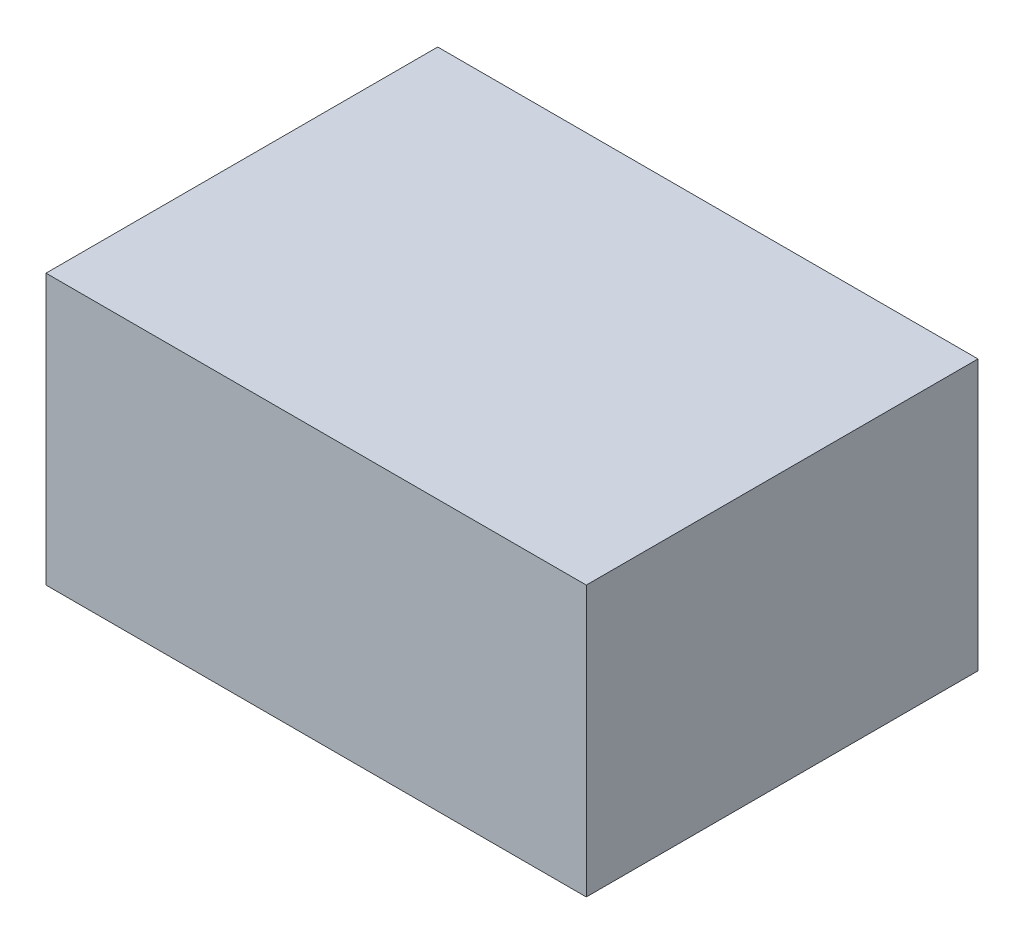
ISO-10303-21;
HEADER;
FILE_DESCRIPTION(('STEP AP214'),'2;1');
FILE_NAME('part.step','',(''),(''),'','','');
FILE_SCHEMA(('AUTOMOTIVE_DESIGN { 1 0 10303 214 1 1 1 1 }'));
ENDSEC;
DATA;
#1=APPLICATION_CONTEXT('core data for automotive mechanical design processes');
#2=APPLICATION_PROTOCOL_DEFINITION('international standard','automotive_design',2000,#1);
#3=PRODUCT_CONTEXT('',#1,'mechanical');
#4=PRODUCT('Part','Part','',(#3));
#5=PRODUCT_RELATED_PRODUCT_CATEGORY('part','',(#4));
#6=PRODUCT_DEFINITION_FORMATION('','',#4);
#7=PRODUCT_DEFINITION_CONTEXT('part definition',#1,'design');
#8=PRODUCT_DEFINITION('design','',#6,#7);
#9=PRODUCT_DEFINITION_SHAPE('','',#8);
#10=(LENGTH_UNIT() NAMED_UNIT(*) SI_UNIT(.MILLI.,.METRE.));
#11=(NAMED_UNIT(*) PLANE_ANGLE_UNIT() SI_UNIT($,.RADIAN.));
#12=(NAMED_UNIT(*) SI_UNIT($,.STERADIAN.) SOLID_ANGLE_UNIT());
#13=UNCERTAINTY_MEASURE_WITH_UNIT(LENGTH_MEASURE(1.E-05),#10,'distance_accuracy_value','');
#14=(GEOMETRIC_REPRESENTATION_CONTEXT(3) GLOBAL_UNCERTAINTY_ASSIGNED_CONTEXT((#13)) GLOBAL_UNIT_ASSIGNED_CONTEXT((#10,
#11,#12)) REPRESENTATION_CONTEXT('',''));
#15=CARTESIAN_POINT('',(0.,0.,0.));
#16=DIRECTION('',(0.,0.,1.));
#17=DIRECTION('',(1.,0.,0.));
#18=AXIS2_PLACEMENT_3D('',#15,#16,#17);
#19=CARTESIAN_POINT('',(-40.,40.,-29.));
#20=DIRECTION('',(1.,0.,0.));
#21=DIRECTION('',(0.,0.,-1.));
#22=AXIS2_PLACEMENT_3D('',#19,#20,#21);
#23=PLANE('',#22);
#24=DIRECTION('',(0.,0.,1.));
#25=VECTOR('',#24,1.);
#26=CARTESIAN_POINT('',(-40.,0.,-29.));
#27=LINE('',#26,#25);
#28=CARTESIAN_POINT('',(-40.,0.,-29.));
#29=VERTEX_POINT('',#28);
#30=CARTESIAN_POINT('',(-40.,0.,29.));
#31=VERTEX_POINT('',#30);
#32=EDGE_CURVE('E104',#29,#31,#27,.T.);
#33=ORIENTED_EDGE('',*,*,#32,.T.);
#34=DIRECTION('',(0.,-1.,0.));
#35=VECTOR('',#34,1.);
#36=CARTESIAN_POINT('',(-40.,40.,29.));
#37=LINE('',#36,#35);
#38=CARTESIAN_POINT('',(-40.,40.,29.));
#39=VERTEX_POINT('',#38);
#40=EDGE_CURVE('E11',#39,#31,#37,.T.);
#41=ORIENTED_EDGE('',*,*,#40,.F.);
#42=DIRECTION('',(0.,0.,1.));
#43=VECTOR('',#42,1.);
#44=CARTESIAN_POINT('',(-40.,40.,-29.));
#45=LINE('',#44,#43);
#46=CARTESIAN_POINT('',(-40.,40.,-29.));
#47=VERTEX_POINT('',#46);
#48=EDGE_CURVE('E92',#47,#39,#45,.T.);
#49=ORIENTED_EDGE('',*,*,#48,.F.);
#50=DIRECTION('',(0.,-1.,0.));
#51=VECTOR('',#50,1.);
#52=CARTESIAN_POINT('',(-40.,40.,-29.));
#53=LINE('',#52,#51);
#54=EDGE_CURVE('E100',#47,#29,#53,.T.);
#55=ORIENTED_EDGE('',*,*,#54,.T.);
#56=EDGE_LOOP('',(#33,#41,#49,#55));
#57=FACE_BOUND('',#56,.T.);
#58=ADVANCED_FACE('F41',(#57),#23,.F.);
#59=CARTESIAN_POINT('',(40.,40.,29.));
#60=DIRECTION('',(0.,0.,-1.));
#61=DIRECTION('',(-1.,0.,0.));
#62=AXIS2_PLACEMENT_3D('',#59,#60,#61);
#63=PLANE('',#62);
#64=DIRECTION('',(1.,0.,0.));
#65=VECTOR('',#64,1.);
#66=CARTESIAN_POINT('',(40.,0.,29.));
#67=LINE('',#66,#65);
#68=CARTESIAN_POINT('',(40.,0.,29.));
#69=VERTEX_POINT('',#68);
#70=EDGE_CURVE('E96',#31,#69,#67,.T.);
#71=ORIENTED_EDGE('',*,*,#70,.T.);
#72=DIRECTION('',(0.,-1.,0.));
#73=VECTOR('',#72,1.);
#74=CARTESIAN_POINT('',(40.,40.,29.));
#75=LINE('',#74,#73);
#76=CARTESIAN_POINT('',(40.,40.,29.));
#77=VERTEX_POINT('',#76);
#78=EDGE_CURVE('E49',#77,#69,#75,.T.);
#79=ORIENTED_EDGE('',*,*,#78,.F.);
#80=DIRECTION('',(1.,0.,0.));
#81=VECTOR('',#80,1.);
#82=CARTESIAN_POINT('',(40.,40.,29.));
#83=LINE('',#82,#81);
#84=EDGE_CURVE('E87',#39,#77,#83,.T.);
#85=ORIENTED_EDGE('',*,*,#84,.F.);
#86=ORIENTED_EDGE('',*,*,#40,.T.);
#87=EDGE_LOOP('',(#71,#79,#85,#86));
#88=FACE_BOUND('',#87,.T.);
#89=ADVANCED_FACE('F95',(#88),#63,.F.);
#90=CARTESIAN_POINT('',(40.,40.,-29.));
#91=DIRECTION('',(-1.,0.,0.));
#92=DIRECTION('',(0.,0.,1.));
#93=AXIS2_PLACEMENT_3D('',#90,#91,#92);
#94=PLANE('',#93);
#95=DIRECTION('',(0.,0.,-1.));
#96=VECTOR('',#95,1.);
#97=CARTESIAN_POINT('',(40.,0.,-29.));
#98=LINE('',#97,#96);
#99=CARTESIAN_POINT('',(40.,0.,-29.));
#100=VERTEX_POINT('',#99);
#101=EDGE_CURVE('E74',#69,#100,#98,.T.);
#102=ORIENTED_EDGE('',*,*,#101,.T.);
#103=DIRECTION('',(0.,-1.,0.));
#104=VECTOR('',#103,1.);
#105=CARTESIAN_POINT('',(40.,40.,-29.));
#106=LINE('',#105,#104);
#107=CARTESIAN_POINT('',(40.,40.,-29.));
#108=VERTEX_POINT('',#107);
#109=EDGE_CURVE('E97',#108,#100,#106,.T.);
#110=ORIENTED_EDGE('',*,*,#109,.F.);
#111=DIRECTION('',(0.,0.,-1.));
#112=VECTOR('',#111,1.);
#113=CARTESIAN_POINT('',(40.,40.,-29.));
#114=LINE('',#113,#112);
#115=EDGE_CURVE('E90',#77,#108,#114,.T.);
#116=ORIENTED_EDGE('',*,*,#115,.F.);
#117=ORIENTED_EDGE('',*,*,#78,.T.);
#118=EDGE_LOOP('',(#102,#110,#116,#117));
#119=FACE_BOUND('',#118,.T.);
#120=ADVANCED_FACE('F98',(#119),#94,.F.);
#121=CARTESIAN_POINT('',(40.,40.,-29.));
#122=DIRECTION('',(0.,0.,1.));
#123=DIRECTION('',(1.,0.,0.));
#124=AXIS2_PLACEMENT_3D('',#121,#122,#123);
#125=PLANE('',#124);
#126=DIRECTION('',(-1.,0.,0.));
#127=VECTOR('',#126,1.);
#128=CARTESIAN_POINT('',(40.,0.,-29.));
#129=LINE('',#128,#127);
#130=EDGE_CURVE('E80',#100,#29,#129,.T.);
#131=ORIENTED_EDGE('',*,*,#130,.T.);
#132=ORIENTED_EDGE('',*,*,#54,.F.);
#133=DIRECTION('',(-1.,0.,0.));
#134=VECTOR('',#133,1.);
#135=CARTESIAN_POINT('',(40.,40.,-29.));
#136=LINE('',#135,#134);
#137=EDGE_CURVE('E57',#108,#47,#136,.T.);
#138=ORIENTED_EDGE('',*,*,#137,.F.);
#139=ORIENTED_EDGE('',*,*,#109,.T.);
#140=EDGE_LOOP('',(#131,#132,#138,#139));
#141=FACE_BOUND('',#140,.T.);
#142=ADVANCED_FACE('F111',(#141),#125,.F.);
#143=CARTESIAN_POINT('',(0.,40.,0.));
#144=DIRECTION('',(0.,-1.,0.));
#145=DIRECTION('',(0.,0.,-1.));
#146=AXIS2_PLACEMENT_3D('',#143,#144,#145);
#147=PLANE('',#146);
#148=ORIENTED_EDGE('',*,*,#48,.T.);
#149=ORIENTED_EDGE('',*,*,#84,.T.);
#150=ORIENTED_EDGE('',*,*,#115,.T.);
#151=ORIENTED_EDGE('',*,*,#137,.T.);
#152=EDGE_LOOP('',(#148,#149,#150,#151));
#153=FACE_BOUND('',#152,.T.);
#154=ADVANCED_FACE('F88',(#153),#147,.F.);
#155=CARTESIAN_POINT('',(0.,0.,0.));
#156=DIRECTION('',(0.,-1.,0.));
#157=DIRECTION('',(0.,0.,-1.));
#158=AXIS2_PLACEMENT_3D('',#155,#156,#157);
#159=PLANE('',#158);
#160=ORIENTED_EDGE('',*,*,#32,.F.);
#161=ORIENTED_EDGE('',*,*,#130,.F.);
#162=ORIENTED_EDGE('',*,*,#101,.F.);
#163=ORIENTED_EDGE('',*,*,#70,.F.);
#164=EDGE_LOOP('',(#160,#161,#162,#163));
#165=FACE_BOUND('',#164,.T.);
#166=ADVANCED_FACE('F114',(#165),#159,.T.);
#167=CLOSED_SHELL('',(#58,#89,#120,#142,#154,#166));
#168=MANIFOLD_SOLID_BREP('B2',#167);
#169=ADVANCED_BREP_SHAPE_REPRESENTATION('',(#18,#168),#14);
#170=SHAPE_DEFINITION_REPRESENTATION(#9,#169);
ENDSEC;
END-ISO-10303-21;
